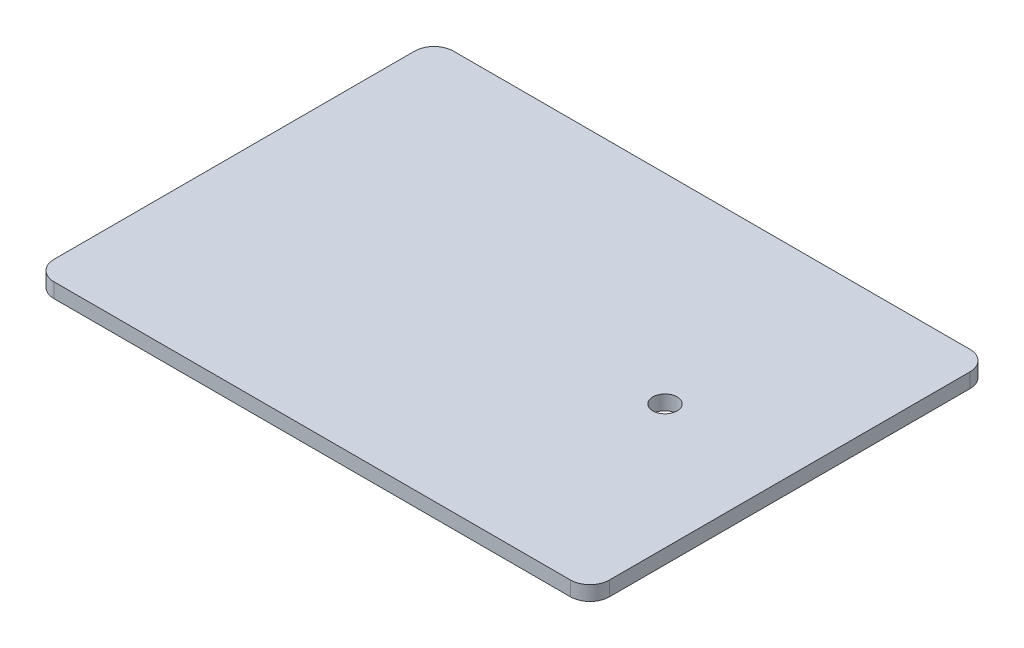
ISO-10303-21;
HEADER;
FILE_DESCRIPTION(('STEP AP214'),'2;1');
FILE_NAME('part.step','',(''),(''),'','','');
FILE_SCHEMA(('AUTOMOTIVE_DESIGN { 1 0 10303 214 1 1 1 1 }'));
ENDSEC;
DATA;
#1=APPLICATION_CONTEXT('core data for automotive mechanical design processes');
#2=APPLICATION_PROTOCOL_DEFINITION('international standard','automotive_design',2000,#1);
#3=PRODUCT_CONTEXT('',#1,'mechanical');
#4=PRODUCT('Part','Part','',(#3));
#5=PRODUCT_RELATED_PRODUCT_CATEGORY('part','',(#4));
#6=PRODUCT_DEFINITION_FORMATION('','',#4);
#7=PRODUCT_DEFINITION_CONTEXT('part definition',#1,'design');
#8=PRODUCT_DEFINITION('design','',#6,#7);
#9=PRODUCT_DEFINITION_SHAPE('','',#8);
#10=(LENGTH_UNIT() NAMED_UNIT(*) SI_UNIT(.MILLI.,.METRE.));
#11=(NAMED_UNIT(*) PLANE_ANGLE_UNIT() SI_UNIT($,.RADIAN.));
#12=(NAMED_UNIT(*) SI_UNIT($,.STERADIAN.) SOLID_ANGLE_UNIT());
#13=UNCERTAINTY_MEASURE_WITH_UNIT(LENGTH_MEASURE(1.E-05),#10,'distance_accuracy_value','');
#14=(GEOMETRIC_REPRESENTATION_CONTEXT(3) GLOBAL_UNCERTAINTY_ASSIGNED_CONTEXT((#13)) GLOBAL_UNIT_ASSIGNED_CONTEXT((#10,
#11,#12)) REPRESENTATION_CONTEXT('',''));
#15=CARTESIAN_POINT('',(0.,0.,0.));
#16=DIRECTION('',(0.,0.,1.));
#17=DIRECTION('',(1.,0.,0.));
#18=AXIS2_PLACEMENT_3D('',#15,#16,#17);
#19=CARTESIAN_POINT('',(-53.,3.,37.));
#20=DIRECTION('',(0.,-1.,0.));
#21=DIRECTION('',(0.,0.,-1.));
#22=AXIS2_PLACEMENT_3D('',#19,#20,#21);
#23=CYLINDRICAL_SURFACE('',#22,4.);
#24=CARTESIAN_POINT('',(-53.,0.,37.));
#25=DIRECTION('',(0.,1.,0.));
#26=DIRECTION('',(0.,0.,1.));
#27=AXIS2_PLACEMENT_3D('',#24,#25,#26);
#28=CIRCLE('',#27,4.);
#29=CARTESIAN_POINT('',(-57.,0.,37.));
#30=VERTEX_POINT('',#29);
#31=CARTESIAN_POINT('',(-53.,0.,41.));
#32=VERTEX_POINT('',#31);
#33=EDGE_CURVE('E128',#30,#32,#28,.T.);
#34=ORIENTED_EDGE('',*,*,#33,.T.);
#35=DIRECTION('',(0.,-1.,0.));
#36=VECTOR('',#35,1.);
#37=CARTESIAN_POINT('',(-53.,3.,41.));
#38=LINE('',#37,#36);
#39=CARTESIAN_POINT('',(-53.,3.,41.));
#40=VERTEX_POINT('',#39);
#41=EDGE_CURVE('E11',#40,#32,#38,.T.);
#42=ORIENTED_EDGE('',*,*,#41,.F.);
#43=CARTESIAN_POINT('',(-53.,3.,37.));
#44=DIRECTION('',(0.,1.,0.));
#45=DIRECTION('',(0.,0.,1.));
#46=AXIS2_PLACEMENT_3D('',#43,#44,#45);
#47=CIRCLE('',#46,4.);
#48=CARTESIAN_POINT('',(-57.,3.,37.));
#49=VERTEX_POINT('',#48);
#50=EDGE_CURVE('E143',#49,#40,#47,.T.);
#51=ORIENTED_EDGE('',*,*,#50,.F.);
#52=DIRECTION('',(0.,-1.,0.));
#53=VECTOR('',#52,1.);
#54=CARTESIAN_POINT('',(-57.,3.,37.));
#55=LINE('',#54,#53);
#56=EDGE_CURVE('E124',#49,#30,#55,.T.);
#57=ORIENTED_EDGE('',*,*,#56,.T.);
#58=EDGE_LOOP('',(#34,#42,#51,#57));
#59=FACE_BOUND('',#58,.T.);
#60=ADVANCED_FACE('F32',(#59),#23,.T.);
#61=CARTESIAN_POINT('',(-53.,3.,41.));
#62=DIRECTION('',(0.,0.,-1.));
#63=DIRECTION('',(-1.,0.,0.));
#64=AXIS2_PLACEMENT_3D('',#61,#62,#63);
#65=PLANE('',#64);
#66=DIRECTION('',(1.,0.,0.));
#67=VECTOR('',#66,1.);
#68=CARTESIAN_POINT('',(-53.,0.,41.));
#69=LINE('',#68,#67);
#70=CARTESIAN_POINT('',(53.,0.,41.));
#71=VERTEX_POINT('',#70);
#72=EDGE_CURVE('E131',#32,#71,#69,.T.);
#73=ORIENTED_EDGE('',*,*,#72,.T.);
#74=DIRECTION('',(0.,-1.,0.));
#75=VECTOR('',#74,1.);
#76=CARTESIAN_POINT('',(53.,3.,41.));
#77=LINE('',#76,#75);
#78=CARTESIAN_POINT('',(53.,3.,41.));
#79=VERTEX_POINT('',#78);
#80=EDGE_CURVE('E40',#79,#71,#77,.T.);
#81=ORIENTED_EDGE('',*,*,#80,.F.);
#82=DIRECTION('',(1.,0.,0.));
#83=VECTOR('',#82,1.);
#84=CARTESIAN_POINT('',(-53.,3.,41.));
#85=LINE('',#84,#83);
#86=EDGE_CURVE('E91',#40,#79,#85,.T.);
#87=ORIENTED_EDGE('',*,*,#86,.F.);
#88=ORIENTED_EDGE('',*,*,#41,.T.);
#89=EDGE_LOOP('',(#73,#81,#87,#88));
#90=FACE_BOUND('',#89,.T.);
#91=ADVANCED_FACE('F199',(#90),#65,.F.);
#92=CARTESIAN_POINT('',(53.,3.,37.));
#93=DIRECTION('',(0.,-1.,0.));
#94=DIRECTION('',(0.,0.,-1.));
#95=AXIS2_PLACEMENT_3D('',#92,#93,#94);
#96=CYLINDRICAL_SURFACE('',#95,4.);
#97=CARTESIAN_POINT('',(53.,0.,37.));
#98=DIRECTION('',(0.,1.,0.));
#99=DIRECTION('',(0.,0.,1.));
#100=AXIS2_PLACEMENT_3D('',#97,#98,#99);
#101=CIRCLE('',#100,4.);
#102=CARTESIAN_POINT('',(57.,0.,37.));
#103=VERTEX_POINT('',#102);
#104=EDGE_CURVE('E134',#71,#103,#101,.T.);
#105=ORIENTED_EDGE('',*,*,#104,.T.);
#106=DIRECTION('',(0.,-1.,0.));
#107=VECTOR('',#106,1.);
#108=CARTESIAN_POINT('',(57.,3.,37.));
#109=LINE('',#108,#107);
#110=CARTESIAN_POINT('',(57.,3.,37.));
#111=VERTEX_POINT('',#110);
#112=EDGE_CURVE('E150',#111,#103,#109,.T.);
#113=ORIENTED_EDGE('',*,*,#112,.F.);
#114=CARTESIAN_POINT('',(53.,3.,37.));
#115=DIRECTION('',(0.,1.,0.));
#116=DIRECTION('',(0.,0.,1.));
#117=AXIS2_PLACEMENT_3D('',#114,#115,#116);
#118=CIRCLE('',#117,4.);
#119=EDGE_CURVE('E158',#79,#111,#118,.T.);
#120=ORIENTED_EDGE('',*,*,#119,.F.);
#121=ORIENTED_EDGE('',*,*,#80,.T.);
#122=EDGE_LOOP('',(#105,#113,#120,#121));
#123=FACE_BOUND('',#122,.T.);
#124=ADVANCED_FACE('F156',(#123),#96,.T.);
#125=CARTESIAN_POINT('',(57.,3.,-37.));
#126=DIRECTION('',(-1.,0.,0.));
#127=DIRECTION('',(0.,0.,1.));
#128=AXIS2_PLACEMENT_3D('',#125,#126,#127);
#129=PLANE('',#128);
#130=DIRECTION('',(0.,0.,-1.));
#131=VECTOR('',#130,1.);
#132=CARTESIAN_POINT('',(57.,0.,-37.));
#133=LINE('',#132,#131);
#134=CARTESIAN_POINT('',(57.,0.,-37.));
#135=VERTEX_POINT('',#134);
#136=EDGE_CURVE('E136',#103,#135,#133,.T.);
#137=ORIENTED_EDGE('',*,*,#136,.T.);
#138=DIRECTION('',(0.,-1.,0.));
#139=VECTOR('',#138,1.);
#140=CARTESIAN_POINT('',(57.,3.,-37.));
#141=LINE('',#140,#139);
#142=CARTESIAN_POINT('',(57.,3.,-37.));
#143=VERTEX_POINT('',#142);
#144=EDGE_CURVE('E147',#143,#135,#141,.T.);
#145=ORIENTED_EDGE('',*,*,#144,.F.);
#146=DIRECTION('',(0.,0.,-1.));
#147=VECTOR('',#146,1.);
#148=CARTESIAN_POINT('',(57.,3.,-37.));
#149=LINE('',#148,#147);
#150=EDGE_CURVE('E170',#111,#143,#149,.T.);
#151=ORIENTED_EDGE('',*,*,#150,.F.);
#152=ORIENTED_EDGE('',*,*,#112,.T.);
#153=EDGE_LOOP('',(#137,#145,#151,#152));
#154=FACE_BOUND('',#153,.T.);
#155=ADVANCED_FACE('F166',(#154),#129,.F.);
#156=CARTESIAN_POINT('',(53.,3.,-37.));
#157=DIRECTION('',(0.,-1.,0.));
#158=DIRECTION('',(0.,0.,-1.));
#159=AXIS2_PLACEMENT_3D('',#156,#157,#158);
#160=CYLINDRICAL_SURFACE('',#159,4.);
#161=CARTESIAN_POINT('',(53.,0.,-37.));
#162=DIRECTION('',(0.,1.,0.));
#163=DIRECTION('',(0.,0.,-1.));
#164=AXIS2_PLACEMENT_3D('',#161,#162,#163);
#165=CIRCLE('',#164,4.);
#166=CARTESIAN_POINT('',(53.,0.,-41.));
#167=VERTEX_POINT('',#166);
#168=EDGE_CURVE('E138',#135,#167,#165,.T.);
#169=ORIENTED_EDGE('',*,*,#168,.T.);
#170=DIRECTION('',(0.,-1.,0.));
#171=VECTOR('',#170,1.);
#172=CARTESIAN_POINT('',(53.,3.,-41.));
#173=LINE('',#172,#171);
#174=CARTESIAN_POINT('',(53.,3.,-41.));
#175=VERTEX_POINT('',#174);
#176=EDGE_CURVE('E119',#175,#167,#173,.T.);
#177=ORIENTED_EDGE('',*,*,#176,.F.);
#178=CARTESIAN_POINT('',(53.,3.,-37.));
#179=DIRECTION('',(0.,1.,0.));
#180=DIRECTION('',(0.,0.,-1.));
#181=AXIS2_PLACEMENT_3D('',#178,#179,#180);
#182=CIRCLE('',#181,4.);
#183=EDGE_CURVE('E110',#143,#175,#182,.T.);
#184=ORIENTED_EDGE('',*,*,#183,.F.);
#185=ORIENTED_EDGE('',*,*,#144,.T.);
#186=EDGE_LOOP('',(#169,#177,#184,#185));
#187=FACE_BOUND('',#186,.T.);
#188=ADVANCED_FACE('F169',(#187),#160,.T.);
#189=CARTESIAN_POINT('',(-53.,3.,-41.));
#190=DIRECTION('',(0.,0.,1.));
#191=DIRECTION('',(1.,0.,0.));
#192=AXIS2_PLACEMENT_3D('',#189,#190,#191);
#193=PLANE('',#192);
#194=DIRECTION('',(-1.,0.,0.));
#195=VECTOR('',#194,1.);
#196=CARTESIAN_POINT('',(-53.,0.,-41.));
#197=LINE('',#196,#195);
#198=CARTESIAN_POINT('',(-53.,0.,-41.));
#199=VERTEX_POINT('',#198);
#200=EDGE_CURVE('E118',#167,#199,#197,.T.);
#201=ORIENTED_EDGE('',*,*,#200,.T.);
#202=DIRECTION('',(0.,-1.,0.));
#203=VECTOR('',#202,1.);
#204=CARTESIAN_POINT('',(-53.,3.,-41.));
#205=LINE('',#204,#203);
#206=CARTESIAN_POINT('',(-53.,3.,-41.));
#207=VERTEX_POINT('',#206);
#208=EDGE_CURVE('E115',#207,#199,#205,.T.);
#209=ORIENTED_EDGE('',*,*,#208,.F.);
#210=DIRECTION('',(-1.,0.,0.));
#211=VECTOR('',#210,1.);
#212=CARTESIAN_POINT('',(-53.,3.,-41.));
#213=LINE('',#212,#211);
#214=EDGE_CURVE('E104',#175,#207,#213,.T.);
#215=ORIENTED_EDGE('',*,*,#214,.F.);
#216=ORIENTED_EDGE('',*,*,#176,.T.);
#217=EDGE_LOOP('',(#201,#209,#215,#216));
#218=FACE_BOUND('',#217,.T.);
#219=ADVANCED_FACE('F116',(#218),#193,.F.);
#220=CARTESIAN_POINT('',(-53.,3.,-37.));
#221=DIRECTION('',(0.,-1.,0.));
#222=DIRECTION('',(0.,0.,-1.));
#223=AXIS2_PLACEMENT_3D('',#220,#221,#222);
#224=CYLINDRICAL_SURFACE('',#223,4.);
#225=CARTESIAN_POINT('',(-53.,0.,-37.));
#226=DIRECTION('',(0.,1.,0.));
#227=DIRECTION('',(0.,0.,1.));
#228=AXIS2_PLACEMENT_3D('',#225,#226,#227);
#229=CIRCLE('',#228,4.);
#230=CARTESIAN_POINT('',(-57.,0.,-37.));
#231=VERTEX_POINT('',#230);
#232=EDGE_CURVE('E77',#199,#231,#229,.T.);
#233=ORIENTED_EDGE('',*,*,#232,.T.);
#234=DIRECTION('',(0.,-1.,0.));
#235=VECTOR('',#234,1.);
#236=CARTESIAN_POINT('',(-57.,3.,-37.));
#237=LINE('',#236,#235);
#238=CARTESIAN_POINT('',(-57.,3.,-37.));
#239=VERTEX_POINT('',#238);
#240=EDGE_CURVE('E120',#239,#231,#237,.T.);
#241=ORIENTED_EDGE('',*,*,#240,.F.);
#242=CARTESIAN_POINT('',(-53.,3.,-37.));
#243=DIRECTION('',(0.,1.,0.));
#244=DIRECTION('',(0.,0.,1.));
#245=AXIS2_PLACEMENT_3D('',#242,#243,#244);
#246=CIRCLE('',#245,4.);
#247=EDGE_CURVE('E108',#207,#239,#246,.T.);
#248=ORIENTED_EDGE('',*,*,#247,.F.);
#249=ORIENTED_EDGE('',*,*,#208,.T.);
#250=EDGE_LOOP('',(#233,#241,#248,#249));
#251=FACE_BOUND('',#250,.T.);
#252=ADVANCED_FACE('F122',(#251),#224,.T.);
#253=CARTESIAN_POINT('',(-57.,3.,-37.));
#254=DIRECTION('',(1.,0.,0.));
#255=DIRECTION('',(0.,0.,-1.));
#256=AXIS2_PLACEMENT_3D('',#253,#254,#255);
#257=PLANE('',#256);
#258=DIRECTION('',(0.,0.,1.));
#259=VECTOR('',#258,1.);
#260=CARTESIAN_POINT('',(-57.,0.,-37.));
#261=LINE('',#260,#259);
#262=EDGE_CURVE('E83',#231,#30,#261,.T.);
#263=ORIENTED_EDGE('',*,*,#262,.T.);
#264=ORIENTED_EDGE('',*,*,#56,.F.);
#265=DIRECTION('',(0.,0.,1.));
#266=VECTOR('',#265,1.);
#267=CARTESIAN_POINT('',(-57.,3.,-37.));
#268=LINE('',#267,#266);
#269=EDGE_CURVE('E48',#239,#49,#268,.T.);
#270=ORIENTED_EDGE('',*,*,#269,.F.);
#271=ORIENTED_EDGE('',*,*,#240,.T.);
#272=EDGE_LOOP('',(#263,#264,#270,#271));
#273=FACE_BOUND('',#272,.T.);
#274=ADVANCED_FACE('F195',(#273),#257,.F.);
#275=CARTESIAN_POINT('',(-53.,3.,37.));
#276=DIRECTION('',(0.,1.,0.));
#277=DIRECTION('',(0.,0.,1.));
#278=AXIS2_PLACEMENT_3D('',#275,#276,#277);
#279=PLANE('',#278);
#280=CARTESIAN_POINT('',(31.4,3.,0.));
#281=DIRECTION('',(0.,-1.,0.));
#282=DIRECTION('',(0.,0.,-1.));
#283=AXIS2_PLACEMENT_3D('',#280,#281,#282);
#284=CIRCLE('',#283,2.5);
#285=CARTESIAN_POINT('',(31.4,3.,-2.49999999999997));
#286=VERTEX_POINT('',#285);
#287=EDGE_CURVE('E132',#286,#286,#284,.T.);
#288=ORIENTED_EDGE('',*,*,#287,.T.);
#289=EDGE_LOOP('',(#288));
#290=FACE_BOUND('',#289,.T.);
#291=ORIENTED_EDGE('',*,*,#50,.T.);
#292=ORIENTED_EDGE('',*,*,#86,.T.);
#293=ORIENTED_EDGE('',*,*,#119,.T.);
#294=ORIENTED_EDGE('',*,*,#150,.T.);
#295=ORIENTED_EDGE('',*,*,#183,.T.);
#296=ORIENTED_EDGE('',*,*,#214,.T.);
#297=ORIENTED_EDGE('',*,*,#247,.T.);
#298=ORIENTED_EDGE('',*,*,#269,.T.);
#299=EDGE_LOOP('',(#291,#292,#293,#294,#295,#296,#297,#298));
#300=FACE_BOUND('',#299,.T.);
#301=ADVANCED_FACE('F106',(#290,#300),#279,.T.);
#302=CARTESIAN_POINT('',(-53.,0.,37.));
#303=DIRECTION('',(0.,1.,0.));
#304=DIRECTION('',(0.,0.,1.));
#305=AXIS2_PLACEMENT_3D('',#302,#303,#304);
#306=PLANE('',#305);
#307=CARTESIAN_POINT('',(31.4,0.,0.));
#308=DIRECTION('',(0.,-1.,0.));
#309=DIRECTION('',(0.,0.,-1.));
#310=AXIS2_PLACEMENT_3D('',#307,#308,#309);
#311=CIRCLE('',#310,2.5);
#312=CARTESIAN_POINT('',(31.4,0.,-2.49999999999997));
#313=VERTEX_POINT('',#312);
#314=EDGE_CURVE('E176',#313,#313,#311,.T.);
#315=ORIENTED_EDGE('',*,*,#314,.F.);
#316=EDGE_LOOP('',(#315));
#317=FACE_BOUND('',#316,.T.);
#318=ORIENTED_EDGE('',*,*,#33,.F.);
#319=ORIENTED_EDGE('',*,*,#262,.F.);
#320=ORIENTED_EDGE('',*,*,#232,.F.);
#321=ORIENTED_EDGE('',*,*,#200,.F.);
#322=ORIENTED_EDGE('',*,*,#168,.F.);
#323=ORIENTED_EDGE('',*,*,#136,.F.);
#324=ORIENTED_EDGE('',*,*,#104,.F.);
#325=ORIENTED_EDGE('',*,*,#72,.F.);
#326=EDGE_LOOP('',(#318,#319,#320,#321,#322,#323,#324,#325));
#327=FACE_BOUND('',#326,.T.);
#328=ADVANCED_FACE('F162',(#317,#327),#306,.F.);
#329=CARTESIAN_POINT('',(31.4,3.,0.));
#330=DIRECTION('',(0.,-1.,0.));
#331=DIRECTION('',(0.,0.,-1.));
#332=AXIS2_PLACEMENT_3D('',#329,#330,#331);
#333=CYLINDRICAL_SURFACE('',#332,2.5);
#334=ORIENTED_EDGE('',*,*,#287,.F.);
#335=EDGE_LOOP('',(#334));
#336=FACE_BOUND('',#335,.T.);
#337=ORIENTED_EDGE('',*,*,#314,.T.);
#338=EDGE_LOOP('',(#337));
#339=FACE_BOUND('',#338,.T.);
#340=ADVANCED_FACE('F183',(#336,#339),#333,.F.);
#341=CLOSED_SHELL('',(#60,#91,#124,#155,#188,#219,#252,#274,#301,#328,#340));
#342=MANIFOLD_SOLID_BREP('B2',#341);
#343=ADVANCED_BREP_SHAPE_REPRESENTATION('',(#18,#342),#14);
#344=SHAPE_DEFINITION_REPRESENTATION(#9,#343);
ENDSEC;
END-ISO-10303-21;
